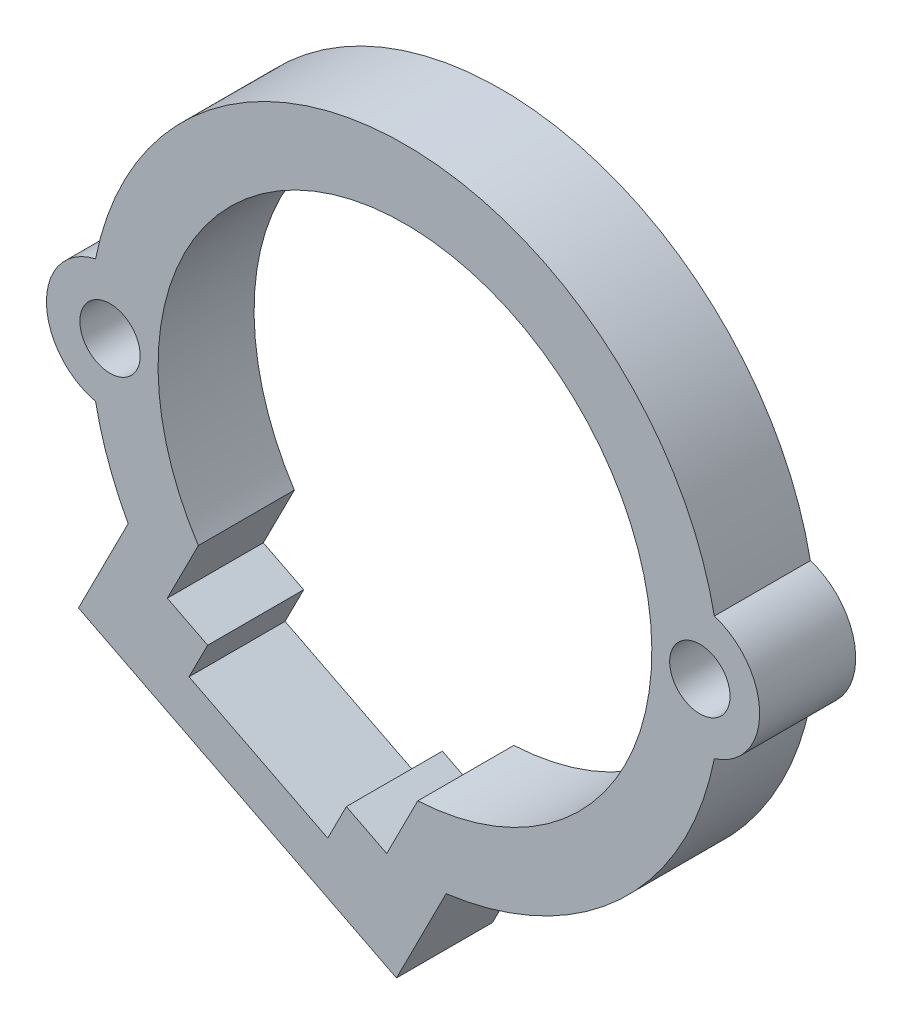
ISO-10303-21;
HEADER;
FILE_DESCRIPTION(('STEP AP214'),'2;1');
FILE_NAME('part.step','',(''),(''),'','','');
FILE_SCHEMA(('AUTOMOTIVE_DESIGN { 1 0 10303 214 1 1 1 1 }'));
ENDSEC;
DATA;
#1=APPLICATION_CONTEXT('core data for automotive mechanical design processes');
#2=APPLICATION_PROTOCOL_DEFINITION('international standard','automotive_design',2000,#1);
#3=PRODUCT_CONTEXT('',#1,'mechanical');
#4=PRODUCT('Part','Part','',(#3));
#5=PRODUCT_RELATED_PRODUCT_CATEGORY('part','',(#4));
#6=PRODUCT_DEFINITION_FORMATION('','',#4);
#7=PRODUCT_DEFINITION_CONTEXT('part definition',#1,'design');
#8=PRODUCT_DEFINITION('design','',#6,#7);
#9=PRODUCT_DEFINITION_SHAPE('','',#8);
#10=(LENGTH_UNIT() NAMED_UNIT(*) SI_UNIT(.MILLI.,.METRE.));
#11=(NAMED_UNIT(*) PLANE_ANGLE_UNIT() SI_UNIT($,.RADIAN.));
#12=(NAMED_UNIT(*) SI_UNIT($,.STERADIAN.) SOLID_ANGLE_UNIT());
#13=UNCERTAINTY_MEASURE_WITH_UNIT(LENGTH_MEASURE(1.E-05),#10,'distance_accuracy_value','');
#14=(GEOMETRIC_REPRESENTATION_CONTEXT(3) GLOBAL_UNCERTAINTY_ASSIGNED_CONTEXT((#13)) GLOBAL_UNIT_ASSIGNED_CONTEXT((#10,
#11,#12)) REPRESENTATION_CONTEXT('',''));
#15=CARTESIAN_POINT('',(0.,0.,0.));
#16=DIRECTION('',(0.,0.,1.));
#17=DIRECTION('',(1.,0.,0.));
#18=AXIS2_PLACEMENT_3D('',#15,#16,#17);
#19=CARTESIAN_POINT('',(0.,0.,7.));
#20=DIRECTION('',(0.,0.,1.));
#21=DIRECTION('',(1.,0.,0.));
#22=AXIS2_PLACEMENT_3D('',#19,#20,#21);
#23=PLANE('',#22);
#24=CARTESIAN_POINT('',(-21.5,0.,7.));
#25=DIRECTION('',(0.,0.,1.));
#26=DIRECTION('',(1.,0.,0.));
#27=AXIS2_PLACEMENT_3D('',#24,#25,#26);
#28=CIRCLE('',#27,2.2);
#29=CARTESIAN_POINT('',(-19.3,0.,7.));
#30=VERTEX_POINT('',#29);
#31=EDGE_CURVE('E200',#30,#30,#28,.T.);
#32=ORIENTED_EDGE('',*,*,#31,.F.);
#33=EDGE_LOOP('',(#32));
#34=FACE_BOUND('',#33,.T.);
#35=CARTESIAN_POINT('',(21.5,0.,7.));
#36=DIRECTION('',(0.,0.,1.));
#37=DIRECTION('',(1.,0.,0.));
#38=AXIS2_PLACEMENT_3D('',#35,#36,#37);
#39=CIRCLE('',#38,2.2);
#40=CARTESIAN_POINT('',(23.7,0.,7.));
#41=VERTEX_POINT('',#40);
#42=EDGE_CURVE('E209',#41,#41,#39,.T.);
#43=ORIENTED_EDGE('',*,*,#42,.F.);
#44=EDGE_LOOP('',(#43));
#45=FACE_BOUND('',#44,.T.);
#46=CARTESIAN_POINT('',(0.,0.,7.));
#47=DIRECTION('',(0.,0.,1.));
#48=DIRECTION('',(1.,0.,0.));
#49=AXIS2_PLACEMENT_3D('',#46,#47,#48);
#50=CIRCLE('',#49,23.);
#51=CARTESIAN_POINT('',(3.0037414094748,-22.8030159747566,7.));
#52=VERTEX_POINT('',#51);
#53=CARTESIAN_POINT('',(22.5554871372799,-4.49999999999999,7.));
#54=VERTEX_POINT('',#53);
#55=EDGE_CURVE('E11',#52,#54,#50,.T.);
#56=ORIENTED_EDGE('',*,*,#55,.T.);
#57=CARTESIAN_POINT('',(21.1440867670861,0.,7.));
#58=DIRECTION('',(0.,0.,1.));
#59=DIRECTION('',(1.,0.,0.));
#60=AXIS2_PLACEMENT_3D('',#57,#58,#59);
#61=CIRCLE('',#60,4.71614789897257);
#62=CARTESIAN_POINT('',(22.5554871372799,4.49999999999999,7.));
#63=VERTEX_POINT('',#62);
#64=EDGE_CURVE('E216',#54,#63,#61,.T.);
#65=ORIENTED_EDGE('',*,*,#64,.T.);
#66=CARTESIAN_POINT('',(-22.5554871372799,4.5,7.));
#67=VERTEX_POINT('',#66);
#68=EDGE_CURVE('E49',#63,#67,#50,.T.);
#69=ORIENTED_EDGE('',*,*,#68,.T.);
#70=CARTESIAN_POINT('',(-21.5191181486277,0.,7.));
#71=DIRECTION('',(0.,0.,1.));
#72=DIRECTION('',(-1.,0.,0.));
#73=AXIS2_PLACEMENT_3D('',#70,#71,#72);
#74=CIRCLE('',#73,4.61779825031801);
#75=CARTESIAN_POINT('',(-22.5554871372799,-4.5,7.));
#76=VERTEX_POINT('',#75);
#77=EDGE_CURVE('E230',#67,#76,#74,.T.);
#78=ORIENTED_EDGE('',*,*,#77,.T.);
#79=CARTESIAN_POINT('',(-20.1802691852822,-11.0343434607389,7.));
#80=VERTEX_POINT('',#79);
#81=EDGE_CURVE('E50',#76,#80,#50,.T.);
#82=ORIENTED_EDGE('',*,*,#81,.T.);
#83=DIRECTION('',(-0.452641250539145,-0.89169271518296,0.));
#84=VECTOR('',#83,1.);
#85=CARTESIAN_POINT('',(-23.8013991895953,-18.1678851822026,7.));
#86=LINE('',#85,#84);
#87=CARTESIAN_POINT('',(-23.8013991895953,-18.1678851822026,7.));
#88=VERTEX_POINT('',#87);
#89=EDGE_CURVE('E283',#80,#88,#86,.T.);
#90=ORIENTED_EDGE('',*,*,#89,.T.);
#91=DIRECTION('',(0.89169271518296,-0.452641250539144,0.));
#92=VECTOR('',#91,1.);
#93=CARTESIAN_POINT('',(-23.8013991895953,-18.1678851822026,7.));
#94=LINE('',#93,#92);
#95=CARTESIAN_POINT('',(-0.617388594838357,-29.9365576962203,7.));
#96=VERTEX_POINT('',#95);
#97=EDGE_CURVE('E287',#88,#96,#94,.T.);
#98=ORIENTED_EDGE('',*,*,#97,.T.);
#99=DIRECTION('',(0.452641250539144,0.89169271518296,0.));
#100=VECTOR('',#99,1.);
#101=CARTESIAN_POINT('',(-0.617388594838357,-29.9365576962203,7.));
#102=LINE('',#101,#100);
#103=EDGE_CURVE('E291',#96,#52,#102,.T.);
#104=ORIENTED_EDGE('',*,*,#103,.T.);
#105=EDGE_LOOP('',(#56,#65,#69,#78,#82,#90,#98,#104));
#106=FACE_BOUND('',#105,.T.);
#107=DIRECTION('',(0.89169271518296,-0.452641250539144,0.));
#108=VECTOR('',#107,1.);
#109=CARTESIAN_POINT('',(-5.6290336746241,-23.6155416865999,7.));
#110=LINE('',#109,#108);
#111=CARTESIAN_POINT('',(-15.7408290647989,-18.4825899054861,7.));
#112=VERTEX_POINT('',#111);
#113=CARTESIAN_POINT('',(-5.6290336746241,-23.6155416865999,7.));
#114=VERTEX_POINT('',#113);
#115=EDGE_CURVE('E168',#112,#114,#110,.T.);
#116=ORIENTED_EDGE('',*,*,#115,.F.);
#117=DIRECTION('',(-0.452641250539142,-0.891692715182961,0.));
#118=VECTOR('',#117,1.);
#119=CARTESIAN_POINT('',(-15.7408290647989,-18.4825899054861,7.));
#120=LINE('',#119,#118);
#121=CARTESIAN_POINT('',(-14.3829053131814,-15.8075117599372,7.));
#122=VERTEX_POINT('',#121);
#123=EDGE_CURVE('E156',#122,#112,#120,.T.);
#124=ORIENTED_EDGE('',*,*,#123,.F.);
#125=DIRECTION('',(0.89169271518296,-0.452641250539144,0.));
#126=VECTOR('',#125,1.);
#127=CARTESIAN_POINT('',(-17.3254912732852,-14.313795633158,7.));
#128=LINE('',#127,#126);
#129=CARTESIAN_POINT('',(-17.3254912732852,-14.313795633158,7.));
#130=VERTEX_POINT('',#129);
#131=EDGE_CURVE('E251',#130,#122,#128,.T.);
#132=ORIENTED_EDGE('',*,*,#131,.F.);
#133=DIRECTION('',(-0.452641250539143,-0.891692715182961,0.));
#134=VECTOR('',#133,1.);
#135=CARTESIAN_POINT('',(-15.0622850205895,-9.85533205724319,7.));
#136=LINE('',#135,#134);
#137=CARTESIAN_POINT('',(-15.0622850205895,-9.85533205724319,7.));
#138=VERTEX_POINT('',#137);
#139=EDGE_CURVE('E246',#138,#130,#136,.T.);
#140=ORIENTED_EDGE('',*,*,#139,.F.);
#141=CARTESIAN_POINT('',(0.,0.,7.));
#142=DIRECTION('',(0.,0.,1.));
#143=DIRECTION('',(1.,0.,0.));
#144=AXIS2_PLACEMENT_3D('',#141,#142,#143);
#145=CIRCLE('',#144,18.);
#146=CARTESIAN_POINT('',(0.934682289792814,-17.9757160919154,7.));
#147=VERTEX_POINT('',#146);
#148=EDGE_CURVE('E321',#147,#138,#145,.T.);
#149=ORIENTED_EDGE('',*,*,#148,.F.);
#150=DIRECTION('',(0.452641250539144,0.89169271518296,0.));
#151=VECTOR('',#150,1.);
#152=CARTESIAN_POINT('',(-1.32852396290291,-22.4341796678302,7.));
#153=LINE('',#152,#151);
#154=CARTESIAN_POINT('',(-1.32852396290291,-22.4341796678302,7.));
#155=VERTEX_POINT('',#154);
#156=EDGE_CURVE('E254',#155,#147,#153,.T.);
#157=ORIENTED_EDGE('',*,*,#156,.F.);
#158=CARTESIAN_POINT('',(-4.27110992300667,-20.9404635410511,7.));
#159=VERTEX_POINT('',#158);
#160=EDGE_CURVE('E249',#159,#155,#128,.T.);
#161=ORIENTED_EDGE('',*,*,#160,.F.);
#162=DIRECTION('',(0.452641250539143,0.891692715182961,0.));
#163=VECTOR('',#162,1.);
#164=CARTESIAN_POINT('',(-4.27110992300667,-20.9404635410511,7.));
#165=LINE('',#164,#163);
#166=EDGE_CURVE('E57',#114,#159,#165,.T.);
#167=ORIENTED_EDGE('',*,*,#166,.F.);
#168=EDGE_LOOP('',(#116,#124,#132,#140,#149,#157,#161,#167));
#169=FACE_BOUND('',#168,.T.);
#170=ADVANCED_FACE('F39',(#34,#45,#106,#169),#23,.T.);
#171=CARTESIAN_POINT('',(0.,0.,0.));
#172=DIRECTION('',(0.,0.,1.));
#173=DIRECTION('',(1.,0.,0.));
#174=AXIS2_PLACEMENT_3D('',#171,#172,#173);
#175=PLANE('',#174);
#176=CARTESIAN_POINT('',(0.,0.,0.));
#177=DIRECTION('',(0.,0.,1.));
#178=DIRECTION('',(1.,0.,0.));
#179=AXIS2_PLACEMENT_3D('',#176,#177,#178);
#180=CIRCLE('',#179,23.);
#181=CARTESIAN_POINT('',(3.0037414094748,-22.8030159747566,0.));
#182=VERTEX_POINT('',#181);
#183=CARTESIAN_POINT('',(22.5554871372799,-4.49999999999999,0.));
#184=VERTEX_POINT('',#183);
#185=EDGE_CURVE('E43',#182,#184,#180,.T.);
#186=ORIENTED_EDGE('',*,*,#185,.F.);
#187=DIRECTION('',(0.452641250539144,0.89169271518296,0.));
#188=VECTOR('',#187,1.);
#189=CARTESIAN_POINT('',(-0.617388594838357,-29.9365576962203,0.));
#190=LINE('',#189,#188);
#191=CARTESIAN_POINT('',(-0.617388594838357,-29.9365576962203,0.));
#192=VERTEX_POINT('',#191);
#193=EDGE_CURVE('E288',#192,#182,#190,.T.);
#194=ORIENTED_EDGE('',*,*,#193,.F.);
#195=DIRECTION('',(0.89169271518296,-0.452641250539144,0.));
#196=VECTOR('',#195,1.);
#197=CARTESIAN_POINT('',(-23.8013991895953,-18.1678851822026,0.));
#198=LINE('',#197,#196);
#199=CARTESIAN_POINT('',(-23.8013991895953,-18.1678851822026,0.));
#200=VERTEX_POINT('',#199);
#201=EDGE_CURVE('E299',#200,#192,#198,.T.);
#202=ORIENTED_EDGE('',*,*,#201,.F.);
#203=DIRECTION('',(-0.452641250539145,-0.89169271518296,0.));
#204=VECTOR('',#203,1.);
#205=CARTESIAN_POINT('',(-23.8013991895953,-18.1678851822026,0.));
#206=LINE('',#205,#204);
#207=CARTESIAN_POINT('',(-20.1802691852822,-11.0343434607389,0.));
#208=VERTEX_POINT('',#207);
#209=EDGE_CURVE('E282',#208,#200,#206,.T.);
#210=ORIENTED_EDGE('',*,*,#209,.F.);
#211=CARTESIAN_POINT('',(-22.5554871372799,-4.5,0.));
#212=VERTEX_POINT('',#211);
#213=EDGE_CURVE('E325',#212,#208,#180,.T.);
#214=ORIENTED_EDGE('',*,*,#213,.F.);
#215=CARTESIAN_POINT('',(-21.5191181486277,0.,0.));
#216=DIRECTION('',(0.,0.,1.));
#217=DIRECTION('',(-1.,0.,0.));
#218=AXIS2_PLACEMENT_3D('',#215,#216,#217);
#219=CIRCLE('',#218,4.61779825031801);
#220=CARTESIAN_POINT('',(-22.5554871372799,4.5,0.));
#221=VERTEX_POINT('',#220);
#222=EDGE_CURVE('E229',#221,#212,#219,.T.);
#223=ORIENTED_EDGE('',*,*,#222,.F.);
#224=CARTESIAN_POINT('',(22.5554871372799,4.5,0.));
#225=VERTEX_POINT('',#224);
#226=EDGE_CURVE('E411',#225,#221,#180,.T.);
#227=ORIENTED_EDGE('',*,*,#226,.F.);
#228=CARTESIAN_POINT('',(21.1440867670861,0.,0.));
#229=DIRECTION('',(0.,0.,1.));
#230=DIRECTION('',(1.,0.,0.));
#231=AXIS2_PLACEMENT_3D('',#228,#229,#230);
#232=CIRCLE('',#231,4.71614789897257);
#233=EDGE_CURVE('E204',#184,#225,#232,.T.);
#234=ORIENTED_EDGE('',*,*,#233,.F.);
#235=EDGE_LOOP('',(#186,#194,#202,#210,#214,#223,#227,#234));
#236=FACE_BOUND('',#235,.T.);
#237=CARTESIAN_POINT('',(21.5,0.,0.));
#238=DIRECTION('',(0.,0.,1.));
#239=DIRECTION('',(1.,0.,0.));
#240=AXIS2_PLACEMENT_3D('',#237,#238,#239);
#241=CIRCLE('',#240,2.2);
#242=CARTESIAN_POINT('',(23.7,0.,0.));
#243=VERTEX_POINT('',#242);
#244=EDGE_CURVE('E176',#243,#243,#241,.T.);
#245=ORIENTED_EDGE('',*,*,#244,.T.);
#246=EDGE_LOOP('',(#245));
#247=FACE_BOUND('',#246,.T.);
#248=CARTESIAN_POINT('',(-21.5,0.,0.));
#249=DIRECTION('',(0.,0.,1.));
#250=DIRECTION('',(1.,0.,0.));
#251=AXIS2_PLACEMENT_3D('',#248,#249,#250);
#252=CIRCLE('',#251,2.2);
#253=CARTESIAN_POINT('',(-19.3,0.,0.));
#254=VERTEX_POINT('',#253);
#255=EDGE_CURVE('E205',#254,#254,#252,.T.);
#256=ORIENTED_EDGE('',*,*,#255,.T.);
#257=EDGE_LOOP('',(#256));
#258=FACE_BOUND('',#257,.T.);
#259=DIRECTION('',(-0.452641250539142,-0.891692715182961,0.));
#260=VECTOR('',#259,1.);
#261=CARTESIAN_POINT('',(-15.7408290647989,-18.4825899054861,0.));
#262=LINE('',#261,#260);
#263=CARTESIAN_POINT('',(-14.3829053131814,-15.8075117599372,0.));
#264=VERTEX_POINT('',#263);
#265=CARTESIAN_POINT('',(-15.7408290647989,-18.4825899054861,0.));
#266=VERTEX_POINT('',#265);
#267=EDGE_CURVE('E185',#264,#266,#262,.T.);
#268=ORIENTED_EDGE('',*,*,#267,.T.);
#269=DIRECTION('',(0.89169271518296,-0.452641250539144,0.));
#270=VECTOR('',#269,1.);
#271=CARTESIAN_POINT('',(-5.6290336746241,-23.6155416865999,0.));
#272=LINE('',#271,#270);
#273=CARTESIAN_POINT('',(-5.6290336746241,-23.6155416865999,0.));
#274=VERTEX_POINT('',#273);
#275=EDGE_CURVE('E174',#266,#274,#272,.T.);
#276=ORIENTED_EDGE('',*,*,#275,.T.);
#277=DIRECTION('',(0.452641250539143,0.891692715182961,0.));
#278=VECTOR('',#277,1.);
#279=CARTESIAN_POINT('',(-4.27110992300667,-20.9404635410511,0.));
#280=LINE('',#279,#278);
#281=CARTESIAN_POINT('',(-4.27110992300667,-20.9404635410511,0.));
#282=VERTEX_POINT('',#281);
#283=EDGE_CURVE('E169',#274,#282,#280,.T.);
#284=ORIENTED_EDGE('',*,*,#283,.T.);
#285=DIRECTION('',(0.89169271518296,-0.452641250539144,0.));
#286=VECTOR('',#285,1.);
#287=CARTESIAN_POINT('',(-17.3254912732852,-14.313795633158,0.));
#288=LINE('',#287,#286);
#289=CARTESIAN_POINT('',(-1.32852396290291,-22.4341796678302,0.));
#290=VERTEX_POINT('',#289);
#291=EDGE_CURVE('E261',#282,#290,#288,.T.);
#292=ORIENTED_EDGE('',*,*,#291,.T.);
#293=DIRECTION('',(0.452641250539144,0.89169271518296,0.));
#294=VECTOR('',#293,1.);
#295=CARTESIAN_POINT('',(-1.32852396290291,-22.4341796678302,0.));
#296=LINE('',#295,#294);
#297=CARTESIAN_POINT('',(0.934682289792814,-17.9757160919154,0.));
#298=VERTEX_POINT('',#297);
#299=EDGE_CURVE('E250',#290,#298,#296,.T.);
#300=ORIENTED_EDGE('',*,*,#299,.T.);
#301=CARTESIAN_POINT('',(0.,0.,0.));
#302=DIRECTION('',(0.,0.,1.));
#303=DIRECTION('',(1.,0.,0.));
#304=AXIS2_PLACEMENT_3D('',#301,#302,#303);
#305=CIRCLE('',#304,18.);
#306=CARTESIAN_POINT('',(-15.0622850205895,-9.85533205724319,0.));
#307=VERTEX_POINT('',#306);
#308=EDGE_CURVE('E320',#298,#307,#305,.T.);
#309=ORIENTED_EDGE('',*,*,#308,.T.);
#310=DIRECTION('',(-0.452641250539143,-0.891692715182961,0.));
#311=VECTOR('',#310,1.);
#312=CARTESIAN_POINT('',(-15.0622850205895,-9.85533205724319,0.));
#313=LINE('',#312,#311);
#314=CARTESIAN_POINT('',(-17.3254912732852,-14.313795633158,0.));
#315=VERTEX_POINT('',#314);
#316=EDGE_CURVE('E245',#307,#315,#313,.T.);
#317=ORIENTED_EDGE('',*,*,#316,.T.);
#318=EDGE_CURVE('E262',#315,#264,#288,.T.);
#319=ORIENTED_EDGE('',*,*,#318,.T.);
#320=EDGE_LOOP('',(#268,#276,#284,#292,#300,#309,#317,#319));
#321=FACE_BOUND('',#320,.T.);
#322=ADVANCED_FACE('F330',(#236,#247,#258,#321),#175,.F.);
#323=CARTESIAN_POINT('',(-17.3254912732852,-14.313795633158,7.));
#324=DIRECTION('',(0.452641250539144,0.89169271518296,0.));
#325=DIRECTION('',(-0.89169271518296,0.452641250539144,0.));
#326=AXIS2_PLACEMENT_3D('',#323,#324,#325);
#327=PLANE('',#326);
#328=ORIENTED_EDGE('',*,*,#131,.T.);
#329=DIRECTION('',(0.,0.,-1.));
#330=VECTOR('',#329,1.);
#331=CARTESIAN_POINT('',(-14.3829053131814,-15.8075117599372,7.));
#332=LINE('',#331,#330);
#333=EDGE_CURVE('E162',#122,#264,#332,.T.);
#334=ORIENTED_EDGE('',*,*,#333,.T.);
#335=ORIENTED_EDGE('',*,*,#318,.F.);
#336=DIRECTION('',(0.,0.,-1.));
#337=VECTOR('',#336,1.);
#338=CARTESIAN_POINT('',(-17.3254912732852,-14.313795633158,7.));
#339=LINE('',#338,#337);
#340=EDGE_CURVE('E275',#130,#315,#339,.T.);
#341=ORIENTED_EDGE('',*,*,#340,.F.);
#342=EDGE_LOOP('',(#328,#334,#335,#341));
#343=FACE_BOUND('',#342,.T.);
#344=ADVANCED_FACE('F342',(#343),#327,.T.);
#345=ORIENTED_EDGE('',*,*,#291,.F.);
#346=DIRECTION('',(0.,0.,-1.));
#347=VECTOR('',#346,1.);
#348=CARTESIAN_POINT('',(-4.27110992300667,-20.9404635410511,7.));
#349=LINE('',#348,#347);
#350=EDGE_CURVE('E195',#159,#282,#349,.T.);
#351=ORIENTED_EDGE('',*,*,#350,.F.);
#352=ORIENTED_EDGE('',*,*,#160,.T.);
#353=DIRECTION('',(0.,0.,-1.));
#354=VECTOR('',#353,1.);
#355=CARTESIAN_POINT('',(-1.32852396290291,-22.4341796678302,7.));
#356=LINE('',#355,#354);
#357=EDGE_CURVE('E271',#155,#290,#356,.T.);
#358=ORIENTED_EDGE('',*,*,#357,.T.);
#359=EDGE_LOOP('',(#345,#351,#352,#358));
#360=FACE_BOUND('',#359,.T.);
#361=ADVANCED_FACE('F347',(#360),#327,.T.);
#362=CARTESIAN_POINT('',(0.,0.,7.));
#363=DIRECTION('',(0.,0.,-1.));
#364=DIRECTION('',(-1.,0.,0.));
#365=AXIS2_PLACEMENT_3D('',#362,#363,#364);
#366=CYLINDRICAL_SURFACE('',#365,23.);
#367=DIRECTION('',(0.,0.,-1.));
#368=VECTOR('',#367,1.);
#369=CARTESIAN_POINT('',(22.5554871372799,-4.5,7.));
#370=LINE('',#369,#368);
#371=EDGE_CURVE('E225',#54,#184,#370,.T.);
#372=ORIENTED_EDGE('',*,*,#371,.F.);
#373=ORIENTED_EDGE('',*,*,#55,.F.);
#374=DIRECTION('',(0.,0.,-1.));
#375=VECTOR('',#374,1.);
#376=CARTESIAN_POINT('',(3.0037414094748,-22.8030159747566,7.));
#377=LINE('',#376,#375);
#378=EDGE_CURVE('E308',#52,#182,#377,.T.);
#379=ORIENTED_EDGE('',*,*,#378,.T.);
#380=ORIENTED_EDGE('',*,*,#185,.T.);
#381=EDGE_LOOP('',(#372,#373,#379,#380));
#382=FACE_BOUND('',#381,.T.);
#383=ADVANCED_FACE('F41',(#382),#366,.T.);
#384=DIRECTION('',(0.,0.,-1.));
#385=VECTOR('',#384,1.);
#386=CARTESIAN_POINT('',(22.5554871372799,4.5,7.));
#387=LINE('',#386,#385);
#388=EDGE_CURVE('E219',#63,#225,#387,.T.);
#389=ORIENTED_EDGE('',*,*,#388,.T.);
#390=ORIENTED_EDGE('',*,*,#226,.T.);
#391=DIRECTION('',(0.,0.,-1.));
#392=VECTOR('',#391,1.);
#393=CARTESIAN_POINT('',(-22.5554871372799,4.5,7.));
#394=LINE('',#393,#392);
#395=EDGE_CURVE('E241',#67,#221,#394,.T.);
#396=ORIENTED_EDGE('',*,*,#395,.F.);
#397=ORIENTED_EDGE('',*,*,#68,.F.);
#398=EDGE_LOOP('',(#389,#390,#396,#397));
#399=FACE_BOUND('',#398,.T.);
#400=ADVANCED_FACE('F396',(#399),#366,.T.);
#401=DIRECTION('',(0.,0.,-1.));
#402=VECTOR('',#401,1.);
#403=CARTESIAN_POINT('',(-22.5554871372799,-4.5,7.));
#404=LINE('',#403,#402);
#405=EDGE_CURVE('E234',#76,#212,#404,.T.);
#406=ORIENTED_EDGE('',*,*,#405,.T.);
#407=ORIENTED_EDGE('',*,*,#213,.T.);
#408=DIRECTION('',(0.,0.,-1.));
#409=VECTOR('',#408,1.);
#410=CARTESIAN_POINT('',(-20.1802691852821,-11.0343434607389,7.));
#411=LINE('',#410,#409);
#412=EDGE_CURVE('E295',#80,#208,#411,.T.);
#413=ORIENTED_EDGE('',*,*,#412,.F.);
#414=ORIENTED_EDGE('',*,*,#81,.F.);
#415=EDGE_LOOP('',(#406,#407,#413,#414));
#416=FACE_BOUND('',#415,.T.);
#417=ADVANCED_FACE('F379',(#416),#366,.T.);
#418=CARTESIAN_POINT('',(0.,0.,7.));
#419=DIRECTION('',(0.,0.,-1.));
#420=DIRECTION('',(-1.,0.,0.));
#421=AXIS2_PLACEMENT_3D('',#418,#419,#420);
#422=CYLINDRICAL_SURFACE('',#421,18.);
#423=ORIENTED_EDGE('',*,*,#148,.T.);
#424=DIRECTION('',(0.,0.,-1.));
#425=VECTOR('',#424,1.);
#426=CARTESIAN_POINT('',(-15.0622850205895,-9.85533205724319,7.));
#427=LINE('',#426,#425);
#428=EDGE_CURVE('E278',#138,#307,#427,.T.);
#429=ORIENTED_EDGE('',*,*,#428,.T.);
#430=ORIENTED_EDGE('',*,*,#308,.F.);
#431=DIRECTION('',(0.,0.,-1.));
#432=VECTOR('',#431,1.);
#433=CARTESIAN_POINT('',(0.934682289792814,-17.9757160919154,7.));
#434=LINE('',#433,#432);
#435=EDGE_CURVE('E257',#147,#298,#434,.T.);
#436=ORIENTED_EDGE('',*,*,#435,.F.);
#437=EDGE_LOOP('',(#423,#429,#430,#436));
#438=FACE_BOUND('',#437,.T.);
#439=ADVANCED_FACE('F334',(#438),#422,.F.);
#440=CARTESIAN_POINT('',(-23.8013991895953,-18.1678851822026,7.));
#441=DIRECTION('',(0.89169271518296,-0.452641250539145,0.));
#442=DIRECTION('',(0.452641250539145,0.89169271518296,0.));
#443=AXIS2_PLACEMENT_3D('',#440,#441,#442);
#444=PLANE('',#443);
#445=ORIENTED_EDGE('',*,*,#209,.T.);
#446=DIRECTION('',(0.,0.,-1.));
#447=VECTOR('',#446,1.);
#448=CARTESIAN_POINT('',(-23.8013991895953,-18.1678851822026,7.));
#449=LINE('',#448,#447);
#450=EDGE_CURVE('E316',#88,#200,#449,.T.);
#451=ORIENTED_EDGE('',*,*,#450,.F.);
#452=ORIENTED_EDGE('',*,*,#89,.F.);
#453=ORIENTED_EDGE('',*,*,#412,.T.);
#454=EDGE_LOOP('',(#445,#451,#452,#453));
#455=FACE_BOUND('',#454,.T.);
#456=ADVANCED_FACE('F378',(#455),#444,.F.);
#457=CARTESIAN_POINT('',(-23.8013991895953,-18.1678851822026,7.));
#458=DIRECTION('',(0.452641250539144,0.89169271518296,0.));
#459=DIRECTION('',(-0.89169271518296,0.452641250539144,0.));
#460=AXIS2_PLACEMENT_3D('',#457,#458,#459);
#461=PLANE('',#460);
#462=ORIENTED_EDGE('',*,*,#201,.T.);
#463=DIRECTION('',(0.,0.,-1.));
#464=VECTOR('',#463,1.);
#465=CARTESIAN_POINT('',(-0.617388594838357,-29.9365576962203,7.));
#466=LINE('',#465,#464);
#467=EDGE_CURVE('E312',#96,#192,#466,.T.);
#468=ORIENTED_EDGE('',*,*,#467,.F.);
#469=ORIENTED_EDGE('',*,*,#97,.F.);
#470=ORIENTED_EDGE('',*,*,#450,.T.);
#471=EDGE_LOOP('',(#462,#468,#469,#470));
#472=FACE_BOUND('',#471,.T.);
#473=ADVANCED_FACE('F382',(#472),#461,.F.);
#474=CARTESIAN_POINT('',(-0.617388594838357,-29.9365576962203,7.));
#475=DIRECTION('',(-0.89169271518296,0.452641250539144,0.));
#476=DIRECTION('',(-0.452641250539144,-0.89169271518296,0.));
#477=AXIS2_PLACEMENT_3D('',#474,#475,#476);
#478=PLANE('',#477);
#479=ORIENTED_EDGE('',*,*,#193,.T.);
#480=ORIENTED_EDGE('',*,*,#378,.F.);
#481=ORIENTED_EDGE('',*,*,#103,.F.);
#482=ORIENTED_EDGE('',*,*,#467,.T.);
#483=EDGE_LOOP('',(#479,#480,#481,#482));
#484=FACE_BOUND('',#483,.T.);
#485=ADVANCED_FACE('F363',(#484),#478,.F.);
#486=CARTESIAN_POINT('',(-15.0622850205895,-9.85533205724319,7.));
#487=DIRECTION('',(0.891692715182961,-0.452641250539143,0.));
#488=DIRECTION('',(0.452641250539143,0.891692715182961,0.));
#489=AXIS2_PLACEMENT_3D('',#486,#487,#488);
#490=PLANE('',#489);
#491=ORIENTED_EDGE('',*,*,#316,.F.);
#492=ORIENTED_EDGE('',*,*,#428,.F.);
#493=ORIENTED_EDGE('',*,*,#139,.T.);
#494=ORIENTED_EDGE('',*,*,#340,.T.);
#495=EDGE_LOOP('',(#491,#492,#493,#494));
#496=FACE_BOUND('',#495,.T.);
#497=ADVANCED_FACE('F338',(#496),#490,.T.);
#498=CARTESIAN_POINT('',(-1.32852396290291,-22.4341796678302,7.));
#499=DIRECTION('',(-0.89169271518296,0.452641250539144,0.));
#500=DIRECTION('',(-0.452641250539144,-0.89169271518296,0.));
#501=AXIS2_PLACEMENT_3D('',#498,#499,#500);
#502=PLANE('',#501);
#503=ORIENTED_EDGE('',*,*,#299,.F.);
#504=ORIENTED_EDGE('',*,*,#357,.F.);
#505=ORIENTED_EDGE('',*,*,#156,.T.);
#506=ORIENTED_EDGE('',*,*,#435,.T.);
#507=EDGE_LOOP('',(#503,#504,#505,#506));
#508=FACE_BOUND('',#507,.T.);
#509=ADVANCED_FACE('F352',(#508),#502,.T.);
#510=CARTESIAN_POINT('',(-21.5191181486277,0.,7.));
#511=DIRECTION('',(0.,0.,-1.));
#512=DIRECTION('',(-1.,0.,0.));
#513=AXIS2_PLACEMENT_3D('',#510,#511,#512);
#514=CYLINDRICAL_SURFACE('',#513,4.61779825031801);
#515=ORIENTED_EDGE('',*,*,#222,.T.);
#516=ORIENTED_EDGE('',*,*,#405,.F.);
#517=ORIENTED_EDGE('',*,*,#77,.F.);
#518=ORIENTED_EDGE('',*,*,#395,.T.);
#519=EDGE_LOOP('',(#515,#516,#517,#518));
#520=FACE_BOUND('',#519,.T.);
#521=ADVANCED_FACE('F354',(#520),#514,.T.);
#522=CARTESIAN_POINT('',(21.1440867670861,0.,7.));
#523=DIRECTION('',(0.,0.,-1.));
#524=DIRECTION('',(-1.,0.,0.));
#525=AXIS2_PLACEMENT_3D('',#522,#523,#524);
#526=CYLINDRICAL_SURFACE('',#525,4.71614789897257);
#527=ORIENTED_EDGE('',*,*,#233,.T.);
#528=ORIENTED_EDGE('',*,*,#388,.F.);
#529=ORIENTED_EDGE('',*,*,#64,.F.);
#530=ORIENTED_EDGE('',*,*,#371,.T.);
#531=EDGE_LOOP('',(#527,#528,#529,#530));
#532=FACE_BOUND('',#531,.T.);
#533=ADVANCED_FACE('F360',(#532),#526,.T.);
#534=CARTESIAN_POINT('',(21.5,0.,7.));
#535=DIRECTION('',(0.,0.,-1.));
#536=DIRECTION('',(-1.,0.,0.));
#537=AXIS2_PLACEMENT_3D('',#534,#535,#536);
#538=CYLINDRICAL_SURFACE('',#537,2.2);
#539=ORIENTED_EDGE('',*,*,#42,.T.);
#540=EDGE_LOOP('',(#539));
#541=FACE_BOUND('',#540,.T.);
#542=ORIENTED_EDGE('',*,*,#244,.F.);
#543=EDGE_LOOP('',(#542));
#544=FACE_BOUND('',#543,.T.);
#545=ADVANCED_FACE('F429',(#541,#544),#538,.F.);
#546=CARTESIAN_POINT('',(-21.5,0.,7.));
#547=DIRECTION('',(0.,0.,-1.));
#548=DIRECTION('',(-1.,0.,0.));
#549=AXIS2_PLACEMENT_3D('',#546,#547,#548);
#550=CYLINDRICAL_SURFACE('',#549,2.2);
#551=ORIENTED_EDGE('',*,*,#31,.T.);
#552=EDGE_LOOP('',(#551));
#553=FACE_BOUND('',#552,.T.);
#554=ORIENTED_EDGE('',*,*,#255,.F.);
#555=EDGE_LOOP('',(#554));
#556=FACE_BOUND('',#555,.T.);
#557=ADVANCED_FACE('F434',(#553,#556),#550,.F.);
#558=CARTESIAN_POINT('',(-15.7408290647989,-18.4825899054861,7.));
#559=DIRECTION('',(0.891692715182961,-0.452641250539142,0.));
#560=DIRECTION('',(0.452641250539142,0.891692715182961,0.));
#561=AXIS2_PLACEMENT_3D('',#558,#559,#560);
#562=PLANE('',#561);
#563=ORIENTED_EDGE('',*,*,#267,.F.);
#564=ORIENTED_EDGE('',*,*,#333,.F.);
#565=ORIENTED_EDGE('',*,*,#123,.T.);
#566=DIRECTION('',(0.,0.,-1.));
#567=VECTOR('',#566,1.);
#568=CARTESIAN_POINT('',(-15.7408290647989,-18.4825899054861,7.));
#569=LINE('',#568,#567);
#570=EDGE_CURVE('E159',#112,#266,#569,.T.);
#571=ORIENTED_EDGE('',*,*,#570,.T.);
#572=EDGE_LOOP('',(#563,#564,#565,#571));
#573=FACE_BOUND('',#572,.T.);
#574=ADVANCED_FACE('F158',(#573),#562,.T.);
#575=CARTESIAN_POINT('',(-5.6290336746241,-23.6155416865999,7.));
#576=DIRECTION('',(0.452641250539144,0.89169271518296,0.));
#577=DIRECTION('',(-0.89169271518296,0.452641250539144,0.));
#578=AXIS2_PLACEMENT_3D('',#575,#576,#577);
#579=PLANE('',#578);
#580=ORIENTED_EDGE('',*,*,#275,.F.);
#581=ORIENTED_EDGE('',*,*,#570,.F.);
#582=ORIENTED_EDGE('',*,*,#115,.T.);
#583=DIRECTION('',(0.,0.,-1.));
#584=VECTOR('',#583,1.);
#585=CARTESIAN_POINT('',(-5.6290336746241,-23.6155416865999,7.));
#586=LINE('',#585,#584);
#587=EDGE_CURVE('E177',#114,#274,#586,.T.);
#588=ORIENTED_EDGE('',*,*,#587,.T.);
#589=EDGE_LOOP('',(#580,#581,#582,#588));
#590=FACE_BOUND('',#589,.T.);
#591=ADVANCED_FACE('F172',(#590),#579,.T.);
#592=CARTESIAN_POINT('',(-4.27110992300667,-20.9404635410511,7.));
#593=DIRECTION('',(-0.891692715182961,0.452641250539143,0.));
#594=DIRECTION('',(-0.452641250539143,-0.891692715182961,0.));
#595=AXIS2_PLACEMENT_3D('',#592,#593,#594);
#596=PLANE('',#595);
#597=ORIENTED_EDGE('',*,*,#283,.F.);
#598=ORIENTED_EDGE('',*,*,#587,.F.);
#599=ORIENTED_EDGE('',*,*,#166,.T.);
#600=ORIENTED_EDGE('',*,*,#350,.T.);
#601=EDGE_LOOP('',(#597,#598,#599,#600));
#602=FACE_BOUND('',#601,.T.);
#603=ADVANCED_FACE('F445',(#602),#596,.T.);
#604=CLOSED_SHELL('',(#170,#322,#344,#361,#383,#400,#417,#439,#456,#473,#485,#497,#509,#521,
#533,#545,#557,#574,#591,#603));
#605=MANIFOLD_SOLID_BREP('B2',#604);
#606=ADVANCED_BREP_SHAPE_REPRESENTATION('',(#18,#605),#14);
#607=SHAPE_DEFINITION_REPRESENTATION(#9,#606);
ENDSEC;
END-ISO-10303-21;
